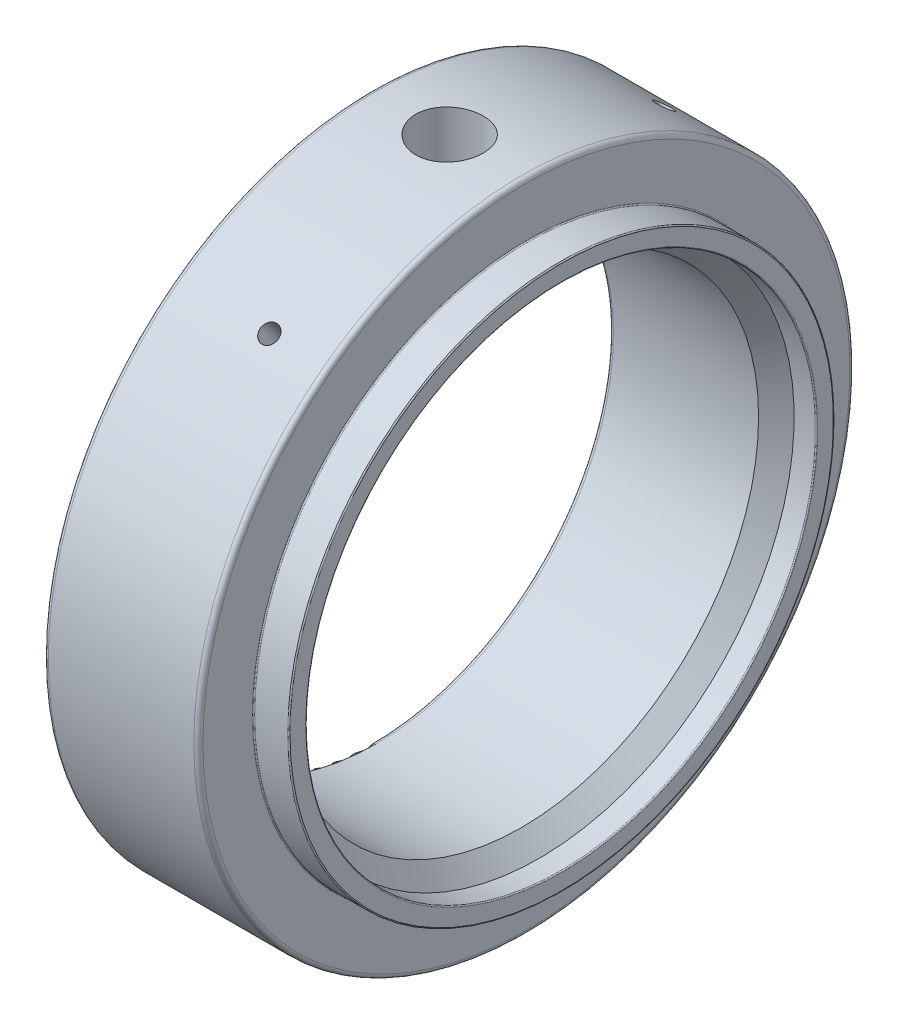
ISO-10303-21;
HEADER;
FILE_DESCRIPTION(('STEP AP214'),'2;1');
FILE_NAME('part.step','',(''),(''),'','','');
FILE_SCHEMA(('AUTOMOTIVE_DESIGN { 1 0 10303 214 1 1 1 1 }'));
ENDSEC;
DATA;
#1=APPLICATION_CONTEXT('core data for automotive mechanical design processes');
#2=APPLICATION_PROTOCOL_DEFINITION('international standard','automotive_design',2000,#1);
#3=PRODUCT_CONTEXT('',#1,'mechanical');
#4=PRODUCT('Part','Part','',(#3));
#5=PRODUCT_RELATED_PRODUCT_CATEGORY('part','',(#4));
#6=PRODUCT_DEFINITION_FORMATION('','',#4);
#7=PRODUCT_DEFINITION_CONTEXT('part definition',#1,'design');
#8=PRODUCT_DEFINITION('design','',#6,#7);
#9=PRODUCT_DEFINITION_SHAPE('','',#8);
#10=(LENGTH_UNIT() NAMED_UNIT(*) SI_UNIT(.MILLI.,.METRE.));
#11=(NAMED_UNIT(*) PLANE_ANGLE_UNIT() SI_UNIT($,.RADIAN.));
#12=(NAMED_UNIT(*) SI_UNIT($,.STERADIAN.) SOLID_ANGLE_UNIT());
#13=UNCERTAINTY_MEASURE_WITH_UNIT(LENGTH_MEASURE(1.E-05),#10,'distance_accuracy_value','');
#14=(GEOMETRIC_REPRESENTATION_CONTEXT(3) GLOBAL_UNCERTAINTY_ASSIGNED_CONTEXT((#13)) GLOBAL_UNIT_ASSIGNED_CONTEXT((#10,
#11,#12)) REPRESENTATION_CONTEXT('',''));
#15=CARTESIAN_POINT('',(0.,0.,0.));
#16=DIRECTION('',(0.,0.,1.));
#17=DIRECTION('',(1.,0.,0.));
#18=AXIS2_PLACEMENT_3D('',#15,#16,#17);
#19=CARTESIAN_POINT('',(0.,0.,0.));
#20=DIRECTION('',(-1.,0.,0.));
#21=DIRECTION('',(0.,0.,1.));
#22=AXIS2_PLACEMENT_3D('',#19,#20,#21);
#23=CYLINDRICAL_SURFACE('',#22,26.02);
#24=CARTESIAN_POINT('',(10.42,21.3669587534692,-14.8490226489001));
#25=CARTESIAN_POINT('',(10.4761481804942,21.3669574659381,-14.8490247878235));
#26=CARTESIAN_POINT('',(10.5323365457762,21.3642500727254,-14.8529226498043));
#27=CARTESIAN_POINT('',(10.6431642924669,21.3534757336192,-14.868408107008));
#28=CARTESIAN_POINT('',(10.69780175209,21.3454024171074,-14.8800048425933));
#29=CARTESIAN_POINT('',(10.803906131119,21.3240911747021,-14.9105291677331));
#30=CARTESIAN_POINT('',(10.8553746104093,21.3108558136662,-14.9294531165917));
#31=CARTESIAN_POINT('',(10.9536926768506,21.2795448816334,-14.9740478258728));
#32=CARTESIAN_POINT('',(11.0005433743418,21.2614704780821,-14.9997169589549));
#33=CARTESIAN_POINT('',(11.0883409735147,21.2209127936836,-15.057041208669));
#34=CARTESIAN_POINT('',(11.1292845179595,21.1984270227013,-15.0886997058241));
#35=CARTESIAN_POINT('',(11.2040771222921,21.1496156141349,-15.1570418924815));
#36=CARTESIAN_POINT('',(11.2379258971259,21.1232898223383,-15.1937257837964));
#37=CARTESIAN_POINT('',(11.2975755742224,21.0674658396433,-15.2710364287853));
#38=CARTESIAN_POINT('',(11.3233741314341,21.0379667277069,-15.3116643268492));
#39=CARTESIAN_POINT('',(11.3661759150158,20.9765793646079,-15.3956559186135));
#40=CARTESIAN_POINT('',(11.3831791879238,20.9446911260877,-15.4390195978369));
#41=CARTESIAN_POINT('',(11.4078996151663,20.8794051617483,-15.5271969890856));
#42=CARTESIAN_POINT('',(11.4156213941221,20.8460081962857,-15.5720099675393));
#43=CARTESIAN_POINT('',(11.4215739008309,20.7786189745776,-15.6618180541209));
#44=CARTESIAN_POINT('',(11.4198046797373,20.7446267215416,-15.7068131612658));
#45=CARTESIAN_POINT('',(11.4068292765525,20.6770354252774,-15.79568681881));
#46=CARTESIAN_POINT('',(11.3956280784618,20.643436183881,-15.8395659462969));
#47=CARTESIAN_POINT('',(11.3641143998613,20.5775944386283,-15.9250092030505));
#48=CARTESIAN_POINT('',(11.3438018927313,20.5453519387362,-15.966573325553));
#49=CARTESIAN_POINT('',(11.2946364869235,20.4831785553302,-16.0462566883532));
#50=CARTESIAN_POINT('',(11.2657813088517,20.4532482914685,-16.0843750056775));
#51=CARTESIAN_POINT('',(11.2003513322428,20.3966211374489,-16.1561238682856));
#52=CARTESIAN_POINT('',(11.1637765027589,20.3699242602538,-16.1897543955777));
#53=CARTESIAN_POINT('',(11.0839172515467,20.3205763701147,-16.2516506056793));
#54=CARTESIAN_POINT('',(11.0406285060772,20.2979279847623,-16.2799128050241));
#55=CARTESIAN_POINT('',(10.9485854578568,20.2574134673838,-16.3302984746201));
#56=CARTESIAN_POINT('',(10.8998311540398,20.2395473362905,-16.3524219436738));
#57=CARTESIAN_POINT('',(10.7982384243771,20.20916909253,-16.3899502865261));
#58=CARTESIAN_POINT('',(10.7453999273776,20.1966570731655,-16.4053550432418));
#59=CARTESIAN_POINT('',(10.6371398423467,20.1773927017637,-16.4290431509705));
#60=CARTESIAN_POINT('',(10.5817182658154,20.1706403240865,-16.4373265336852));
#61=CARTESIAN_POINT('',(10.4699032170995,20.1631178145086,-16.4465533228084));
#62=CARTESIAN_POINT('',(10.413510389379,20.1623438581667,-16.447501421654));
#63=CARTESIAN_POINT('',(10.3013202586606,20.166793391979,-16.4420453776539));
#64=CARTESIAN_POINT('',(10.2455229545122,20.1720168705439,-16.4356412490154));
#65=CARTESIAN_POINT('',(10.1361246716542,20.1882884258402,-16.4156502991676));
#66=CARTESIAN_POINT('',(10.0825230430599,20.1993347654754,-16.4020656200817));
#67=CARTESIAN_POINT('',(9.9790176858823,20.2268931844197,-16.3680685533874));
#68=CARTESIAN_POINT('',(9.92911396979263,20.2434052821941,-16.3476561427125));
#69=CARTESIAN_POINT('',(9.8343931688599,20.2813755204256,-16.3005251373577));
#70=CARTESIAN_POINT('',(9.78957868516602,20.3028361733008,-16.2738033391896));
#71=CARTESIAN_POINT('',(9.70633460920016,20.3500192824529,-16.2147630080062));
#72=CARTESIAN_POINT('',(9.66790504204978,20.3757417554974,-16.1824444529714));
#73=CARTESIAN_POINT('',(9.59850143288535,20.4306608592441,-16.1130522244332));
#74=CARTESIAN_POINT('',(9.56753129370484,20.4598592967135,-16.0759760772002));
#75=CARTESIAN_POINT('',(9.51395234502105,20.5208238569972,-15.9980821047054));
#76=CARTESIAN_POINT('',(9.49134351031719,20.5525899720725,-15.9572642907214));
#77=CARTESIAN_POINT('',(9.45513579531089,20.6177249754962,-15.8730163728156));
#78=CARTESIAN_POINT('',(9.44153439825381,20.651093413345,-15.8295870022876));
#79=CARTESIAN_POINT('',(9.42371940427786,20.7184588464773,-15.7413132988119));
#80=CARTESIAN_POINT('',(9.4195057830107,20.7524558401304,-15.6964689695343));
#81=CARTESIAN_POINT('',(9.4205862324978,20.8200789528759,-15.6066610797986));
#82=CARTESIAN_POINT('',(9.42587416724623,20.8537052972211,-15.5616976149996));
#83=CARTESIAN_POINT('',(9.44579497452529,20.9196686017129,-15.4729094084508));
#84=CARTESIAN_POINT('',(9.46042786528524,20.9520055593441,-15.4290846689225));
#85=CARTESIAN_POINT('',(9.49862213367768,21.0145101339542,-15.343844352609));
#86=CARTESIAN_POINT('',(9.52218363808947,21.0446777201224,-15.3024288100422));
#87=CARTESIAN_POINT('',(9.57756483174632,21.1020434519088,-15.2232242451921));
#88=CARTESIAN_POINT('',(9.60938423867257,21.1292416989968,-15.1854350989912));
#89=CARTESIAN_POINT('',(9.68039846005755,21.1799826588935,-15.1145836178057));
#90=CARTESIAN_POINT('',(9.71959723704951,21.203523395258,-15.0815238392341));
#91=CARTESIAN_POINT('',(9.80426077955695,21.2463439862047,-15.0211398186314));
#92=CARTESIAN_POINT('',(9.84972709060732,21.2656227867574,-14.9938169955038));
#93=CARTESIAN_POINT('',(9.94565930501404,21.2994479696,-14.9457279494552));
#94=CARTESIAN_POINT('',(9.99612898017105,21.313990745689,-14.9249667231532));
#95=CARTESIAN_POINT('',(10.1005700004616,21.3379563914966,-14.8906836206294));
#96=CARTESIAN_POINT('',(10.1545370981946,21.3473853458663,-14.8771531412278));
#97=CARTESIAN_POINT('',(10.2440359209761,21.35840855263,-14.8613201143651));
#98=CARTESIAN_POINT('',(10.2789871501544,21.3616113541656,-14.8567147987609));
#99=CARTESIAN_POINT('',(10.349286939232,21.3658868595319,-14.8505653931893));
#100=CARTESIAN_POINT('',(10.3846354989359,21.3669595644107,-14.8490213017156));
#101=CARTESIAN_POINT('',(10.42,21.3669587534692,-14.8490226489001));
#102=B_SPLINE_CURVE_WITH_KNOTS('',3,(#24,#25,#26,#27,#28,#29,#30,#31,#32,#33,#34,#35,#36,#37,
#38,#39,#40,#41,#42,#43,#44,#45,#46,#47,#48,#49,#50,#51,#52,#53,#54,#55,#56,#57,#58,#59,#60,#61,
#62,#63,#64,#65,#66,#67,#68,#69,#70,#71,#72,#73,#74,#75,#76,#77,#78,#79,#80,#81,#82,#83,#84,#85,
#86,#87,#88,#89,#90,#91,#92,#93,#94,#95,#96,#97,#98,#99,#100,#101),.UNSPECIFIED.,.T.,.F.,(4,2,2,
2,2,2,2,2,2,2,2,2,2,2,2,2,2,2,2,2,2,2,2,2,2,2,2,2,2,2,2,2,2,2,2,2,2,2,4),(0.,0.168315453234023,
0.336831094467285,0.505263112025369,0.673654530995067,0.842141278721586,1.01063479461958,
1.17917734743002,1.34771900843323,1.51617665657379,1.6846333967831,1.85300117769809,
2.02136945052704,2.18978268868687,2.35819660200072,2.52671942718744,2.69524228524765,
2.86376807993082,3.03229312439371,3.20071035317823,3.36912725652036,3.537493945556,
3.70586120340011,3.87431413149449,4.04276772235501,4.21130925897883,4.37985028762215,
4.5483442045789,4.7168376845266,4.88522239224552,5.05360742843555,5.22199485565054,
5.39037652684231,5.5588488739343,5.72736283982408,5.89600482068136,6.06444570117439,
6.17045795128667,6.27647014923521),.UNSPECIFIED.);
#103=CARTESIAN_POINT('',(10.42,21.3669587534692,-14.8490226489001));
#104=VERTEX_POINT('',#103);
#105=EDGE_CURVE('E102',#104,#104,#102,.T.);
#106=ORIENTED_EDGE('',*,*,#105,.T.);
#107=EDGE_LOOP('',(#106));
#108=FACE_BOUND('',#107,.T.);
#109=CARTESIAN_POINT('',(10.42,20.1633287071653,16.4462936689944));
#110=CARTESIAN_POINT('',(10.4761481804942,20.1633304083388,16.4462918417729));
#111=CARTESIAN_POINT('',(10.5323365457762,20.1663310150506,16.4426149320119));
#112=CARTESIAN_POINT('',(10.6431642924669,20.1782467815627,16.4279896020529));
#113=CARTESIAN_POINT('',(10.69780175209,20.1871689716629,16.4170325385981));
#114=CARTESIAN_POINT('',(10.803906131119,20.2106366617083,16.3881332133113));
#115=CARTESIAN_POINT('',(10.8553746104093,20.2251793689628,16.3701944204906));
#116=CARTESIAN_POINT('',(10.9536926768506,20.2594160923225,16.3278044531137));
#117=CARTESIAN_POINT('',(11.0005433743418,20.2791088659194,16.303354849334));
#118=CARTESIAN_POINT('',(11.0883409735147,20.3230332585323,16.2485675962304));
#119=CARTESIAN_POINT('',(11.1292845179595,20.3472674407415,16.2182266214365));
#120=CARTESIAN_POINT('',(11.2040771222921,20.3995079194009,16.1524684244359));
#121=CARTESIAN_POINT('',(11.2379258971259,20.4275143673393,16.1170509983634));
#122=CARTESIAN_POINT('',(11.2975755742224,20.4864429540742,16.0420798403227));
#123=CARTESIAN_POINT('',(11.3233741314341,20.5173659390564,16.0025249075593));
#124=CARTESIAN_POINT('',(11.3661759150158,20.5811831885551,15.9203643665328));
#125=CARTESIAN_POINT('',(11.3831791879238,20.6140774426402,15.8777587744128));
#126=CARTESIAN_POINT('',(11.4078996151663,20.6808437407129,15.7906968946443));
#127=CARTESIAN_POINT('',(11.4156213941221,20.7147152891289,15.7462415400973));
#128=CARTESIAN_POINT('',(11.4215739008309,20.7824693758631,15.6567083990339));
#129=CARTESIAN_POINT('',(11.4198046797373,20.816351914121,15.6116306158735));
#130=CARTESIAN_POINT('',(11.4068292765525,20.8831520707177,15.5221607918287));
#131=CARTESIAN_POINT('',(11.3956280784618,20.9160701891661,15.4777684013857));
#132=CARTESIAN_POINT('',(11.3641143998613,20.9800550744957,15.3909259003166));
#133=CARTESIAN_POINT('',(11.3438018927313,21.0111218359675,15.3484757953656));
#134=CARTESIAN_POINT('',(11.2946364869235,21.0705810934266,15.2667471919657));
#135=CARTESIAN_POINT('',(11.2657813088517,21.0989728729944,15.2274695435706));
#136=CARTESIAN_POINT('',(11.2003513322428,21.1523337473453,15.1532593626894));
#137=CARTESIAN_POINT('',(11.1637765027589,21.1773028284067,15.118326847623));
#138=CARTESIAN_POINT('',(11.0839172515467,21.223199162348,15.0538297033694));
#139=CARTESIAN_POINT('',(11.0406285060772,21.2441237909691,15.0242685601584));
#140=CARTESIAN_POINT('',(10.9485854578568,21.2813902907335,14.9714353337345));
#141=CARTESIAN_POINT('',(10.8998311540398,21.297732160983,14.9481632517485));
#142=CARTESIAN_POINT('',(10.7982384243771,21.3254333406943,14.9086175964396));
#143=CARTESIAN_POINT('',(10.7453999273776,21.3367925633269,14.8923441450775));
#144=CARTESIAN_POINT('',(10.6371398423467,21.354253053541,14.867296715374));
#145=CARTESIAN_POINT('',(10.5817182658154,21.3603543445291,14.8585227036477));
#146=CARTESIAN_POINT('',(10.4699032170995,21.3671502188406,14.8487483555766));
#147=CARTESIAN_POINT('',(10.413510389379,21.3678482586651,14.8477430495319));
#148=CARTESIAN_POINT('',(10.3013202586606,21.3638300302911,14.8535241054918));
#149=CARTESIAN_POINT('',(10.2455229545122,21.3591137725549,14.8603104524401));
#150=CARTESIAN_POINT('',(10.1361246716542,21.3443822866777,14.8814619278361));
#151=CARTESIAN_POINT('',(10.0825230430599,21.3343686388693,14.8958247960306));
#152=CARTESIAN_POINT('',(9.9790176858823,21.3092846906101,14.9316865101315));
#153=CARTESIAN_POINT('',(9.92911396979263,21.2942143730761,14.9531853801459));
#154=CARTESIAN_POINT('',(9.8343931688599,21.2593751590034,15.0026757814365));
#155=CARTESIAN_POINT('',(9.78957868516602,21.2396038755904,15.0306706108049));
#156=CARTESIAN_POINT('',(9.70633460920016,21.1958560941542,15.0922996471022));
#157=CARTESIAN_POINT('',(9.66790504204978,21.1718795795862,15.1259338762182));
#158=CARTESIAN_POINT('',(9.59850143288535,21.1203132448372,15.1978525974137));
#159=CARTESIAN_POINT('',(9.56753129370483,21.0927215447672,15.2361395081214));
#160=CARTESIAN_POINT('',(9.51395234502105,21.0346491628587,15.3162128933445));
#161=CARTESIAN_POINT('',(9.49134351031719,21.0041684897278,15.3579993573119));
#162=CARTESIAN_POINT('',(9.45513579531089,20.9411378333973,15.4438330144925));
#163=CARTESIAN_POINT('',(9.44153439825381,20.9085884310064,15.487879572507));
#164=CARTESIAN_POINT('',(9.42371940427786,20.8423027309586,15.5769669132217));
#165=CARTESIAN_POINT('',(9.4195057830107,20.8085664363803,15.6220076933429));
#166=CARTESIAN_POINT('',(9.4205862324978,20.7408770079735,15.7117656106435));
#167=CARTESIAN_POINT('',(9.42587416724623,20.7069240281867,15.7564829379825));
#168=CARTESIAN_POINT('',(9.44579497452529,20.6397572770114,15.8443642824089));
#169=CARTESIAN_POINT('',(9.46042786528524,20.606543507065,15.8875282964659));
#170=CARTESIAN_POINT('',(9.49862213367768,20.5418338517152,15.9711069652571));
#171=CARTESIAN_POINT('',(9.52218363808947,20.5103379907119,16.0115215809423));
#172=CARTESIAN_POINT('',(9.57756483174633,20.4500138150022,16.088496798392));
#173=CARTESIAN_POINT('',(9.60938423867257,20.4211854091473,16.1250575318518));
#174=CARTESIAN_POINT('',(9.68039846005755,20.3670646982007,16.1933621879453));
#175=CARTESIAN_POINT('',(9.71959723704951,20.3417743057092,16.2251035060561));
#176=CARTESIAN_POINT('',(9.80426077955695,20.29553241412,16.2829093917031));
#177=CARTESIAN_POINT('',(9.84972709060732,20.2745819884302,16.3089725549384));
#178=CARTESIAN_POINT('',(9.94565930501404,20.2376793144283,16.3547425450597));
#179=CARTESIAN_POINT('',(9.99612898017106,20.2217308751708,16.374444528188));
#180=CARTESIAN_POINT('',(10.1005700004616,20.1953816691377,16.4069314892502));
#181=CARTESIAN_POINT('',(10.1545370981946,20.1849743096119,16.4197246874837));
#182=CARTESIAN_POINT('',(10.2440359209761,20.1727930349229,16.4346850475711));
#183=CARTESIAN_POINT('',(10.2789871501544,20.1692489331814,16.4390331750228));
#184=CARTESIAN_POINT('',(10.349286939232,20.1645162341466,16.4448380604538));
#185=CARTESIAN_POINT('',(10.3846354989359,20.1633276356942,16.4462948198558));
#186=CARTESIAN_POINT('',(10.42,20.1633287071653,16.4462936689944));
#187=B_SPLINE_CURVE_WITH_KNOTS('',3,(#109,#110,#111,#112,#113,#114,#115,#116,#117,#118,#119,
#120,#121,#122,#123,#124,#125,#126,#127,#128,#129,#130,#131,#132,#133,#134,#135,#136,#137,#138,
#139,#140,#141,#142,#143,#144,#145,#146,#147,#148,#149,#150,#151,#152,#153,#154,#155,#156,#157,
#158,#159,#160,#161,#162,#163,#164,#165,#166,#167,#168,#169,#170,#171,#172,#173,#174,#175,#176,
#177,#178,#179,#180,#181,#182,#183,#184,#185,#186),.UNSPECIFIED.,.T.,.F.,(4,2,2,2,2,2,2,2,2,2,2,
2,2,2,2,2,2,2,2,2,2,2,2,2,2,2,2,2,2,2,2,2,2,2,2,2,2,2,4),(0.,0.168315453234025,
0.336831094467287,0.505263112025371,0.673654530995072,0.842141278721592,1.01063479461958,
1.17917734743002,1.34771900843323,1.51617665657379,1.68463339678311,1.85300117769809,
2.02136945052705,2.18978268868687,2.35819660200072,2.52671942718744,2.69524228524766,
2.86376807993083,3.03229312439372,3.20071035317823,3.36912725652037,3.537493945556,
3.70586120340011,3.87431413149449,4.04276772235501,4.21130925897884,4.37985028762215,
4.54834420457891,4.71683768452661,4.88522239224552,5.05360742843555,5.22199485565054,
5.39037652684232,5.5588488739343,5.72736283982409,5.89600482068137,6.0644457011744,
6.17045795128667,6.27647014923521),.UNSPECIFIED.);
#188=CARTESIAN_POINT('',(10.42,20.1633287071653,16.4462936689944));
#189=VERTEX_POINT('',#188);
#190=EDGE_CURVE('E92',#189,#189,#187,.T.);
#191=ORIENTED_EDGE('',*,*,#190,.T.);
#192=EDGE_LOOP('',(#191));
#193=FACE_BOUND('',#192,.T.);
#194=CARTESIAN_POINT('',(16.4300000000001,0.,0.));
#195=DIRECTION('',(-1.,0.,0.));
#196=DIRECTION('',(0.,0.,1.));
#197=AXIS2_PLACEMENT_3D('',#194,#195,#196);
#198=CIRCLE('',#197,26.02);
#199=CARTESIAN_POINT('',(16.4300000000001,0.,26.02));
#200=VERTEX_POINT('',#199);
#201=EDGE_CURVE('E66',#200,#200,#198,.T.);
#202=ORIENTED_EDGE('',*,*,#201,.F.);
#203=EDGE_LOOP('',(#202));
#204=FACE_BOUND('',#203,.T.);
#205=CARTESIAN_POINT('',(0.500000000000001,0.,0.));
#206=DIRECTION('',(-1.,0.,0.));
#207=DIRECTION('',(0.,0.,1.));
#208=AXIS2_PLACEMENT_3D('',#205,#206,#207);
#209=CIRCLE('',#208,26.02);
#210=CARTESIAN_POINT('',(0.500000000000001,0.,26.02));
#211=VERTEX_POINT('',#210);
#212=EDGE_CURVE('E112',#211,#211,#209,.T.);
#213=ORIENTED_EDGE('',*,*,#212,.T.);
#214=EDGE_LOOP('',(#213));
#215=FACE_BOUND('',#214,.T.);
#216=ADVANCED_FACE('F50',(#108,#193,#204,#215),#23,.F.);
#217=CARTESIAN_POINT('',(16.4300000000001,0.,0.));
#218=DIRECTION('',(1.,0.,0.));
#219=DIRECTION('',(0.,0.,-1.));
#220=AXIS2_PLACEMENT_3D('',#217,#218,#219);
#221=CONICAL_SURFACE('',#220,26.02,0.785398163397455);
#222=CARTESIAN_POINT('',(18.38,0.,0.));
#223=DIRECTION('',(-1.,0.,0.));
#224=DIRECTION('',(0.,0.,1.));
#225=AXIS2_PLACEMENT_3D('',#222,#223,#224);
#226=CIRCLE('',#225,27.97);
#227=CARTESIAN_POINT('',(18.38,0.,27.97));
#228=VERTEX_POINT('',#227);
#229=EDGE_CURVE('E157',#228,#228,#226,.T.);
#230=ORIENTED_EDGE('',*,*,#229,.F.);
#231=EDGE_LOOP('',(#230));
#232=FACE_BOUND('',#231,.T.);
#233=ORIENTED_EDGE('',*,*,#201,.T.);
#234=EDGE_LOOP('',(#233));
#235=FACE_BOUND('',#234,.T.);
#236=ADVANCED_FACE('F167',(#232,#235),#221,.F.);
#237=CARTESIAN_POINT('',(0.,0.,0.));
#238=DIRECTION('',(-1.,0.,0.));
#239=DIRECTION('',(0.,0.,1.));
#240=AXIS2_PLACEMENT_3D('',#237,#238,#239);
#241=CYLINDRICAL_SURFACE('',#240,27.97);
#242=CARTESIAN_POINT('',(20.715,0.,0.));
#243=DIRECTION('',(-1.,0.,0.));
#244=DIRECTION('',(0.,0.,1.));
#245=AXIS2_PLACEMENT_3D('',#242,#243,#244);
#246=CIRCLE('',#245,27.97);
#247=CARTESIAN_POINT('',(20.715,0.,27.97));
#248=VERTEX_POINT('',#247);
#249=EDGE_CURVE('E154',#248,#248,#246,.T.);
#250=ORIENTED_EDGE('',*,*,#249,.F.);
#251=EDGE_LOOP('',(#250));
#252=FACE_BOUND('',#251,.T.);
#253=ORIENTED_EDGE('',*,*,#229,.T.);
#254=EDGE_LOOP('',(#253));
#255=FACE_BOUND('',#254,.T.);
#256=ADVANCED_FACE('F233',(#252,#255),#241,.F.);
#257=CARTESIAN_POINT('',(20.715,0.,0.));
#258=DIRECTION('',(-1.,0.,0.));
#259=DIRECTION('',(0.,0.,1.));
#260=AXIS2_PLACEMENT_3D('',#257,#258,#259);
#261=TOROIDAL_SURFACE('',#260,28.095,0.125);
#262=CARTESIAN_POINT('',(20.84,0.,0.));
#263=DIRECTION('',(-1.,0.,0.));
#264=DIRECTION('',(0.,0.,1.));
#265=AXIS2_PLACEMENT_3D('',#262,#263,#264);
#266=CIRCLE('',#265,28.095);
#267=CARTESIAN_POINT('',(20.84,0.,28.095));
#268=VERTEX_POINT('',#267);
#269=EDGE_CURVE('E151',#268,#268,#266,.T.);
#270=ORIENTED_EDGE('',*,*,#269,.F.);
#271=EDGE_LOOP('',(#270));
#272=FACE_BOUND('',#271,.T.);
#273=ORIENTED_EDGE('',*,*,#249,.T.);
#274=EDGE_LOOP('',(#273));
#275=FACE_BOUND('',#274,.T.);
#276=ADVANCED_FACE('F230',(#272,#275),#261,.T.);
#277=CARTESIAN_POINT('',(20.84,29.82,0.));
#278=DIRECTION('',(-1.,0.,0.));
#279=DIRECTION('',(0.,0.,1.));
#280=AXIS2_PLACEMENT_3D('',#277,#278,#279);
#281=PLANE('',#280);
#282=CARTESIAN_POINT('',(20.84,0.,0.));
#283=DIRECTION('',(-1.,0.,0.));
#284=DIRECTION('',(0.,0.,1.));
#285=AXIS2_PLACEMENT_3D('',#282,#283,#284);
#286=CIRCLE('',#285,29.82);
#287=CARTESIAN_POINT('',(20.84,0.,29.82));
#288=VERTEX_POINT('',#287);
#289=EDGE_CURVE('E150',#288,#288,#286,.T.);
#290=ORIENTED_EDGE('',*,*,#289,.F.);
#291=EDGE_LOOP('',(#290));
#292=FACE_BOUND('',#291,.T.);
#293=ORIENTED_EDGE('',*,*,#269,.T.);
#294=EDGE_LOOP('',(#293));
#295=FACE_BOUND('',#294,.T.);
#296=ADVANCED_FACE('F222',(#292,#295),#281,.F.);
#297=CARTESIAN_POINT('',(20.715,0.,0.));
#298=DIRECTION('',(-1.,0.,0.));
#299=DIRECTION('',(0.,0.,1.));
#300=AXIS2_PLACEMENT_3D('',#297,#298,#299);
#301=TOROIDAL_SURFACE('',#300,29.82,0.125000000000007);
#302=CARTESIAN_POINT('',(20.715,0.,0.));
#303=DIRECTION('',(-1.,0.,0.));
#304=DIRECTION('',(0.,0.,1.));
#305=AXIS2_PLACEMENT_3D('',#302,#303,#304);
#306=CIRCLE('',#305,29.945);
#307=CARTESIAN_POINT('',(20.715,0.,29.945));
#308=VERTEX_POINT('',#307);
#309=EDGE_CURVE('E141',#308,#308,#306,.T.);
#310=ORIENTED_EDGE('',*,*,#309,.F.);
#311=EDGE_LOOP('',(#310));
#312=FACE_BOUND('',#311,.T.);
#313=ORIENTED_EDGE('',*,*,#289,.T.);
#314=EDGE_LOOP('',(#313));
#315=FACE_BOUND('',#314,.T.);
#316=ADVANCED_FACE('F214',(#312,#315),#301,.T.);
#317=CARTESIAN_POINT('',(0.,0.,0.));
#318=DIRECTION('',(-1.,0.,0.));
#319=DIRECTION('',(0.,0.,1.));
#320=AXIS2_PLACEMENT_3D('',#317,#318,#319);
#321=CYLINDRICAL_SURFACE('',#320,29.945);
#322=CARTESIAN_POINT('',(17.095,0.,0.));
#323=DIRECTION('',(-1.,0.,0.));
#324=DIRECTION('',(0.,0.,1.));
#325=AXIS2_PLACEMENT_3D('',#322,#323,#324);
#326=CIRCLE('',#325,29.945);
#327=CARTESIAN_POINT('',(17.095,0.,29.945));
#328=VERTEX_POINT('',#327);
#329=EDGE_CURVE('E139',#328,#328,#326,.T.);
#330=ORIENTED_EDGE('',*,*,#329,.F.);
#331=EDGE_LOOP('',(#330));
#332=FACE_BOUND('',#331,.T.);
#333=ORIENTED_EDGE('',*,*,#309,.T.);
#334=EDGE_LOOP('',(#333));
#335=FACE_BOUND('',#334,.T.);
#336=ADVANCED_FACE('F207',(#332,#335),#321,.T.);
#337=CARTESIAN_POINT('',(17.095,0.,0.));
#338=DIRECTION('',(-1.,0.,0.));
#339=DIRECTION('',(0.,0.,1.));
#340=AXIS2_PLACEMENT_3D('',#337,#338,#339);
#341=TOROIDAL_SURFACE('',#340,30.07,0.125);
#342=CARTESIAN_POINT('',(16.97,0.,0.));
#343=DIRECTION('',(-1.,0.,0.));
#344=DIRECTION('',(0.,0.,1.));
#345=AXIS2_PLACEMENT_3D('',#342,#343,#344);
#346=CIRCLE('',#345,30.07);
#347=CARTESIAN_POINT('',(16.97,0.,30.07));
#348=VERTEX_POINT('',#347);
#349=EDGE_CURVE('E133',#348,#348,#346,.T.);
#350=ORIENTED_EDGE('',*,*,#349,.F.);
#351=EDGE_LOOP('',(#350));
#352=FACE_BOUND('',#351,.T.);
#353=ORIENTED_EDGE('',*,*,#329,.T.);
#354=EDGE_LOOP('',(#353));
#355=FACE_BOUND('',#354,.T.);
#356=ADVANCED_FACE('F201',(#352,#355),#341,.F.);
#357=CARTESIAN_POINT('',(16.97,35.5,0.));
#358=DIRECTION('',(-1.,0.,0.));
#359=DIRECTION('',(0.,0.,1.));
#360=AXIS2_PLACEMENT_3D('',#357,#358,#359);
#361=PLANE('',#360);
#362=CARTESIAN_POINT('',(16.97,0.,0.));
#363=DIRECTION('',(-1.,0.,0.));
#364=DIRECTION('',(0.,0.,1.));
#365=AXIS2_PLACEMENT_3D('',#362,#363,#364);
#366=CIRCLE('',#365,35.5);
#367=CARTESIAN_POINT('',(16.97,0.,35.5));
#368=VERTEX_POINT('',#367);
#369=EDGE_CURVE('E132',#368,#368,#366,.T.);
#370=ORIENTED_EDGE('',*,*,#369,.F.);
#371=EDGE_LOOP('',(#370));
#372=FACE_BOUND('',#371,.T.);
#373=ORIENTED_EDGE('',*,*,#349,.T.);
#374=EDGE_LOOP('',(#373));
#375=FACE_BOUND('',#374,.T.);
#376=ADVANCED_FACE('F196',(#372,#375),#361,.F.);
#377=CARTESIAN_POINT('',(16.47,0.,0.));
#378=DIRECTION('',(-1.,0.,0.));
#379=DIRECTION('',(0.,0.,1.));
#380=AXIS2_PLACEMENT_3D('',#377,#378,#379);
#381=TOROIDAL_SURFACE('',#380,35.5,0.5);
#382=CARTESIAN_POINT('',(16.47,0.,0.));
#383=DIRECTION('',(-1.,0.,0.));
#384=DIRECTION('',(0.,0.,1.));
#385=AXIS2_PLACEMENT_3D('',#382,#383,#384);
#386=CIRCLE('',#385,36.);
#387=CARTESIAN_POINT('',(16.47,0.,36.));
#388=VERTEX_POINT('',#387);
#389=EDGE_CURVE('E130',#388,#388,#386,.T.);
#390=ORIENTED_EDGE('',*,*,#389,.F.);
#391=EDGE_LOOP('',(#390));
#392=FACE_BOUND('',#391,.T.);
#393=ORIENTED_EDGE('',*,*,#369,.T.);
#394=EDGE_LOOP('',(#393));
#395=FACE_BOUND('',#394,.T.);
#396=ADVANCED_FACE('F193',(#392,#395),#381,.T.);
#397=CARTESIAN_POINT('',(0.,0.,0.));
#398=DIRECTION('',(-1.,0.,0.));
#399=DIRECTION('',(0.,0.,1.));
#400=AXIS2_PLACEMENT_3D('',#397,#398,#399);
#401=CYLINDRICAL_SURFACE('',#400,36.);
#402=CARTESIAN_POINT('',(10.42,29.3415990844754,-20.858345168443));
#403=CARTESIAN_POINT('',(10.3638411879063,29.3415977375915,-20.8583472673777));
#404=CARTESIAN_POINT('',(10.3076419311546,29.3388486272889,-20.8622159332431));
#405=CARTESIAN_POINT('',(10.1967919720463,29.3279115685913,-20.877588188732));
#406=CARTESIAN_POINT('',(10.1421432030553,29.3197171163533,-20.8891009082966));
#407=CARTESIAN_POINT('',(10.0360161473415,29.2980972219112,-20.9194130835519));
#408=CARTESIAN_POINT('',(9.984536328979,29.2846743301104,-20.9382089865236));
#409=CARTESIAN_POINT('',(9.88619783189316,29.2529424002588,-20.9825189118631));
#410=CARTESIAN_POINT('',(9.83933802594934,29.2346345581302,-21.0080312898988));
#411=CARTESIAN_POINT('',(9.75153598875193,29.1935941844351,-21.0650252428046));
#412=CARTESIAN_POINT('',(9.71059580874287,29.1708601254869,-21.096508878116));
#413=CARTESIAN_POINT('',(9.63581237396165,29.1215618428828,-21.1645079230016));
#414=CARTESIAN_POINT('',(9.60196940124822,29.0949974670723,-21.2010235324622));
#415=CARTESIAN_POINT('',(9.54233836594181,29.0387372812901,-21.2780169958512));
#416=CARTESIAN_POINT('',(9.51655145605428,29.0090410240041,-21.318495415713));
#417=CARTESIAN_POINT('',(9.47377207906029,28.9473196481593,-21.4022285673698));
#418=CARTESIAN_POINT('',(9.45677957920736,28.9152945382727,-21.4454832888264));
#419=CARTESIAN_POINT('',(9.43207557356109,28.8498026977308,-21.5335062446201));
#420=CARTESIAN_POINT('',(9.42436165930401,28.8163363435198,-21.5782740830908));
#421=CARTESIAN_POINT('',(9.41842637813699,28.7488903363899,-21.6680515098498));
#422=CARTESIAN_POINT('',(9.42020497632026,28.7149106853589,-21.7130610972486));
#423=CARTESIAN_POINT('',(9.43320218872393,28.6474158701094,-21.8020338945305));
#424=CARTESIAN_POINT('',(9.44441819998671,28.6139005804046,-21.8459973895014));
#425=CARTESIAN_POINT('',(9.47596783220647,28.5482967256605,-21.9316590021199));
#426=CARTESIAN_POINT('',(9.49630147171824,28.5162081635247,-21.9733571151572));
#427=CARTESIAN_POINT('',(9.54551214655929,28.4543993773135,-22.0533379280627));
#428=CARTESIAN_POINT('',(9.57439037504475,28.4246794847325,-22.0916201499675));
#429=CARTESIAN_POINT('',(9.63986958617474,28.3685024247974,-22.1637127331176));
#430=CARTESIAN_POINT('',(9.67647058350585,28.3420452636484,-22.1975230858584));
#431=CARTESIAN_POINT('',(9.75637110013543,28.2931879675779,-22.2597637954547));
#432=CARTESIAN_POINT('',(9.79967287871988,28.2707892065674,-22.2881923305214));
#433=CARTESIAN_POINT('',(9.89173780129957,28.2307478461288,-22.3388881328699));
#434=CARTESIAN_POINT('',(9.94050094616207,28.2131052474561,-22.3611553991732));
#435=CARTESIAN_POINT('',(10.042105657951,28.1831236317462,-22.3989313769344));
#436=CARTESIAN_POINT('',(10.0949472595081,28.1707846597486,-22.4144400309967));
#437=CARTESIAN_POINT('',(10.2032083145037,28.1517965922549,-22.4382838675134));
#438=CARTESIAN_POINT('',(10.258627761901,28.1451474834251,-22.4466190667781));
#439=CARTESIAN_POINT('',(10.3704514930706,28.1377494545443,-22.4558921354853));
#440=CARTESIAN_POINT('',(10.4268554414592,28.1369985630366,-22.4568324766309));
#441=CARTESIAN_POINT('',(10.5390644902428,28.141415422733,-22.4512972912765));
#442=CARTESIAN_POINT('',(10.5948695912288,28.1465831680962,-22.4448217720951));
#443=CARTESIAN_POINT('',(10.7042880157073,28.1626734703961,-22.4246290471534));
#444=CARTESIAN_POINT('',(10.7579016780267,28.1735951340422,-22.4109129654833));
#445=CARTESIAN_POINT('',(10.8614257168641,28.2008508258484,-22.3766058619696));
#446=CARTESIAN_POINT('',(10.9113360870599,28.2171848632481,-22.3560148283897));
#447=CARTESIAN_POINT('',(11.0060513176579,28.2547627252522,-22.3085028065281));
#448=CARTESIAN_POINT('',(11.0508548164682,28.2760078546995,-22.2815801359415));
#449=CARTESIAN_POINT('',(11.1340708173387,28.3227513542107,-22.2221326980951));
#450=CARTESIAN_POINT('',(11.1724833050472,28.3482497338256,-22.1896079182553));
#451=CARTESIAN_POINT('',(11.2418374250192,28.4027310538865,-22.1198287700038));
#452=CARTESIAN_POINT('',(11.2727770190596,28.4317149417792,-22.0825731154694));
#453=CARTESIAN_POINT('',(11.3262931438933,28.4922904757928,-22.0043592706848));
#454=CARTESIAN_POINT('',(11.3488696921026,28.5238821164829,-21.9634010881453));
#455=CARTESIAN_POINT('',(11.3850152887936,28.5887325562577,-21.8789214466361));
#456=CARTESIAN_POINT('',(11.3985856594238,28.6219911098604,-21.8354003649337));
#457=CARTESIAN_POINT('',(11.4163380258155,28.6892103134457,-21.7470065375925));
#458=CARTESIAN_POINT('',(11.4205200262096,28.7231709630818,-21.7021337926207));
#459=CARTESIAN_POINT('',(11.4193767825572,28.7908101641141,-21.6123207797371));
#460=CARTESIAN_POINT('',(11.4140547527564,28.8244888070145,-21.5673805397876));
#461=CARTESIAN_POINT('',(11.3940611258114,28.8906296256823,-21.4787006326016));
#462=CARTESIAN_POINT('',(11.3793895101092,28.923091799035,-21.4349609677484));
#463=CARTESIAN_POINT('',(11.3411135752231,28.985905780406,-21.3499429043462));
#464=CARTESIAN_POINT('',(11.3175091031024,29.0162575522824,-21.3086645479507));
#465=CARTESIAN_POINT('',(11.2620387562501,29.0740289287908,-21.2297723832334));
#466=CARTESIAN_POINT('',(11.2301731839371,29.1014486407066,-21.1921584408358));
#467=CARTESIAN_POINT('',(11.1590762874034,29.1526357404124,-21.1216886180088));
#468=CARTESIAN_POINT('',(11.1198432582393,29.1764022804822,-21.0888338420477));
#469=CARTESIAN_POINT('',(11.0351162840071,29.2196603480737,-21.0288568530051));
#470=CARTESIAN_POINT('',(10.9896207902157,29.2391508150095,-21.0017360621728));
#471=CARTESIAN_POINT('',(10.8936439479609,29.2733571676661,-20.9540312360341));
#472=CARTESIAN_POINT('',(10.8431595065091,29.2880700669167,-20.9334512895966));
#473=CARTESIAN_POINT('',(10.7386984883521,29.3123160167407,-20.8994872978638));
#474=CARTESIAN_POINT('',(10.6847261657713,29.3218552489383,-20.8860946651916));
#475=CARTESIAN_POINT('',(10.595343728085,29.332983596727,-20.8704605588524));
#476=CARTESIAN_POINT('',(10.5605138679449,29.336210723169,-20.865923283103));
#477=CARTESIAN_POINT('',(10.4904613132708,29.3405188893452,-20.859864929757));
#478=CARTESIAN_POINT('',(10.4552386188358,29.3415999296203,-20.8583438514003));
#479=CARTESIAN_POINT('',(10.42,29.3415990844754,-20.858345168443));
#480=B_SPLINE_CURVE_WITH_KNOTS('',3,(#402,#403,#404,#405,#406,#407,#408,#409,#410,#411,#412,
#413,#414,#415,#416,#417,#418,#419,#420,#421,#422,#423,#424,#425,#426,#427,#428,#429,#430,#431,
#432,#433,#434,#435,#436,#437,#438,#439,#440,#441,#442,#443,#444,#445,#446,#447,#448,#449,#450,
#451,#452,#453,#454,#455,#456,#457,#458,#459,#460,#461,#462,#463,#464,#465,#466,#467,#468,#469,
#470,#471,#472,#473,#474,#475,#476,#477,#478,#479),.UNSPECIFIED.,.T.,.F.,(4,2,2,2,2,2,2,2,2,2,2,
2,2,2,2,2,2,2,2,2,2,2,2,2,2,2,2,2,2,2,2,2,2,2,2,2,2,2,4),(0.,0.168347811368222,
0.336897057367516,0.50536418875251,0.673790114188511,0.842274262734764,1.01076510594557,
1.17928004671562,1.34779436000659,1.5162649222049,1.68473486488719,1.85315835665889,
2.02158219118154,2.190029555315,2.35847723979171,2.52698184360877,2.69548647418438,
2.86399253571065,3.03249820236109,3.20094754424068,3.36939671987995,3.53781975163662,
3.70624307091239,3.87471119062398,4.04317968864838,4.21169408450575,4.3802081294344,
4.54869743024603,4.71718664791754,4.88561889363431,5.05405147367266,5.22248693752328,
5.39091623623433,5.55938456022856,5.7278946219614,5.89650981789808,6.06492310192588,
6.17055827529617,6.27619342204291),.UNSPECIFIED.);
#481=CARTESIAN_POINT('',(10.42,29.3415990844754,-20.858345168443));
#482=VERTEX_POINT('',#481);
#483=EDGE_CURVE('E10',#482,#482,#480,.T.);
#484=ORIENTED_EDGE('',*,*,#483,.T.);
#485=EDGE_LOOP('',(#484));
#486=FACE_BOUND('',#485,.T.);
#487=CARTESIAN_POINT('',(10.42,28.1379690381716,22.4556161885372));
#488=CARTESIAN_POINT('',(10.3638411879063,28.1379706845456,22.4556143152845));
#489=CARTESIAN_POINT('',(10.3076419311546,28.1409317273617,22.451905352023));
#490=CARTESIAN_POINT('',(10.1967919720463,28.1526938258035,22.4371548085749));
#491=CARTESIAN_POINT('',(10.1421432030553,28.1615018649899,22.4261044599402));
#492=CARTESIAN_POINT('',(10.0360161473415,28.1846805474463,22.3969669157064));
#493=CARTESIAN_POINT('',(9.984536328979,28.1990484786101,22.3788831509743));
#494=CARTESIAN_POINT('',(9.88619783189316,28.2328954073496,22.3361669916127));
#495=CARTESIAN_POINT('',(9.83933802594933,28.2523731539326,22.3115361998168));
#496=CARTESIAN_POINT('',(9.75153598875193,28.295846997674,22.2563759981203));
#497=CARTESIAN_POINT('',(9.71059580874287,28.3198446544523,22.2258445520714));
#498=CARTESIAN_POINT('',(9.63581237396165,28.3716210833979,22.1597129243981));
#499=CARTESIAN_POINT('',(9.60196940124822,28.3994000057688,22.1241125414173));
#500=CARTESIAN_POINT('',(9.54233836594181,28.4579034641156,22.0488095051547));
#501=CARTESIAN_POINT('',(9.51655145605428,28.4886284208048,22.0091062658946));
#502=CARTESIAN_POINT('',(9.47377207906029,28.5521051753374,21.9266958869575));
#503=CARTESIAN_POINT('',(9.45677957920736,28.5848569656333,21.8839887584664));
#504=CARTESIAN_POINT('',(9.43207557356109,28.6514180636465,21.7967715459708));
#505=CARTESIAN_POINT('',(9.424361659304,28.6852270945948,21.7522619329433));
#506=CARTESIAN_POINT('',(9.41842637813699,28.7529360570324,21.6626826572214));
#507=CARTESIAN_POINT('',(9.42020497632026,28.7868359881871,21.617612996587));
#508=CARTESIAN_POINT('',(9.43320218872393,28.8537580377879,21.5282085894308));
#509=CARTESIAN_POINT('',(9.44441819998671,28.8867803956894,21.4838736437031));
#510=CARTESIAN_POINT('',(9.47596783220647,28.9510407496588,21.3971996306344));
#511=CARTESIAN_POINT('',(9.49630147171824,28.9822787420954,21.3548605673554));
#512=CARTESIAN_POINT('',(9.54551214655929,29.0421244235539,21.2734004489128));
#513=CARTESIAN_POINT('',(9.57439037504475,29.0707317445002,21.2342798441466));
#514=CARTESIAN_POINT('',(9.63986958617474,29.1245470869856,21.1604075792471));
#515=CARTESIAN_POINT('',(9.67647058350585,29.1497551020599,21.1256559274225));
#516=CARTESIAN_POINT('',(9.75637110013543,29.1961178162216,21.0615354155255));
#517=CARTESIAN_POINT('',(9.79967287871988,29.2172711427944,21.0321683782941));
#518=CARTESIAN_POINT('',(9.89173780129957,29.2549661810222,20.9797044953409));
#519=CARTESIAN_POINT('',(9.94050094616207,29.271507891945,20.9566076506149));
#520=CARTESIAN_POINT('',(10.042105657951,29.299556439116,20.9173750012271));
#521=CARTESIAN_POINT('',(10.0949472595081,29.3110632326067,20.9012392556806));
#522=CARTESIAN_POINT('',(10.2032083145037,29.3287495786184,20.876414501669));
#523=CARTESIAN_POINT('',(10.258627761901,29.3349291436232,20.8677254757533));
#524=CARTESIAN_POINT('',(10.3704514930706,29.3418038162562,20.8580580298259));
#525=CARTESIAN_POINT('',(10.4268554414592,29.342500756431,20.8570770334348));
#526=CARTESIAN_POINT('',(10.5390644902428,29.3383974462976,20.8628484953324));
#527=CARTESIAN_POINT('',(10.5948695912288,29.3335972014147,20.869600945989));
#528=CARTESIAN_POINT('',(10.7042880157073,29.3186217967718,20.8906338065757));
#529=CARTESIAN_POINT('',(10.7579016780267,29.3084474713325,20.9049130479783));
#530=CARTESIAN_POINT('',(10.8614257168641,29.2829820536467,20.9405692198062));
#531=CARTESIAN_POINT('',(10.9113360870599,29.2676909526652,20.961946162348));
#532=CARTESIAN_POINT('',(11.0060513176579,29.2323773284731,21.0111644097833));
#533=CARTESIAN_POINT('',(11.0508548164682,29.2123535477907,21.0390074326782));
#534=CARTESIAN_POINT('',(11.1340708173387,29.1680932574742,21.1003261028705));
#535=CARTESIAN_POINT('',(11.1724833050472,29.14385673838,21.1338017628165));
#536=CARTESIAN_POINT('',(11.2418374250192,29.0917978029936,21.2054063088503));
#537=CARTESIAN_POINT('',(11.2727770190596,29.0639744115526,21.2435364601861));
#538=CARTESIAN_POINT('',(11.3262931438934,29.0054873184919,21.323324058109));
#539=CARTESIAN_POINT('',(11.3488696921026,28.9748236227871,21.3649814973506));
#540=CARTESIAN_POINT('',(11.3850152887936,28.9114917830609,21.4506054860767));
#541=CARTESIAN_POINT('',(11.3985856594238,28.8788239340279,21.4945716956001));
#542=CARTESIAN_POINT('',(11.4163380258155,28.8123824571838,21.583551582077));
#543=CARTESIAN_POINT('',(11.4205200262096,28.7786088299183,21.6285652585136));
#544=CARTESIAN_POINT('',(11.4193767825572,28.7109189113586,21.7183400529991));
#545=CARTESIAN_POINT('',(11.4140547527564,28.6770026721654,21.7631012512999));
#546=CARTESIAN_POINT('',(11.3940611258114,28.6099889545573,21.8511233819541));
#547=CARTESIAN_POINT('',(11.3793895101092,28.5768914777677,21.8943843113294));
#548=CARTESIAN_POINT('',(11.3411135752231,28.5124807496899,21.9781991397836));
#549=CARTESIAN_POINT('',(11.3175091031024,28.4811675289599,22.0187529925015));
#550=CARTESIAN_POINT('',(11.2620387562501,28.4212554623702,22.0960320315381));
#551=CARTESIAN_POINT('',(11.2301731839371,28.3926565171999,22.1327573579407));
#552=CARTESIAN_POINT('',(11.1590762874034,28.3390256526116,22.201385671843));
#553=CARTESIAN_POINT('',(11.1198432582393,28.3139945612133,22.233287540029));
#554=CARTESIAN_POINT('',(11.0351162840071,28.2682645183776,22.2914017621145));
#555=CARTESIAN_POINT('',(10.9896207902157,28.2475666417568,22.3176127044886));
#556=CARTESIAN_POINT('',(10.8936439479609,28.2111383682767,22.3636431931916));
#557=CARTESIAN_POINT('',(10.8431595065091,28.1954110787077,22.3834587416964));
#558=CARTESIAN_POINT('',(10.7386984883521,28.1694458839125,22.416127189418));
#559=CARTESIAN_POINT('',(10.6847261657713,28.1592014278564,22.4289883977954));
#560=CARTESIAN_POINT('',(10.595343728085,28.1472403486414,22.4439949959958));
#561=CARTESIAN_POINT('',(10.560513867945,28.143768355859,22.4483477517226));
#562=CARTESIAN_POINT('',(10.4904613132708,28.1391321843803,22.4541589353443));
#563=CARTESIAN_POINT('',(10.4552386188358,28.1379680051023,22.4556173639688));
#564=CARTESIAN_POINT('',(10.42,28.1379690381716,22.4556161885372));
#565=B_SPLINE_CURVE_WITH_KNOTS('',3,(#487,#488,#489,#490,#491,#492,#493,#494,#495,#496,#497,
#498,#499,#500,#501,#502,#503,#504,#505,#506,#507,#508,#509,#510,#511,#512,#513,#514,#515,#516,
#517,#518,#519,#520,#521,#522,#523,#524,#525,#526,#527,#528,#529,#530,#531,#532,#533,#534,#535,
#536,#537,#538,#539,#540,#541,#542,#543,#544,#545,#546,#547,#548,#549,#550,#551,#552,#553,#554,
#555,#556,#557,#558,#559,#560,#561,#562,#563,#564),.UNSPECIFIED.,.T.,.F.,(4,2,2,2,2,2,2,2,2,2,2,
2,2,2,2,2,2,2,2,2,2,2,2,2,2,2,2,2,2,2,2,2,2,2,2,2,2,2,4),(0.,0.168347811368221,
0.336897057367516,0.505364188752512,0.673790114188513,0.842274262734761,1.01076510594557,
1.17928004671562,1.3477943600066,1.5162649222049,1.6847348648872,1.85315835665889,
2.02158219118154,2.190029555315,2.35847723979171,2.52698184360878,2.69548647418438,
2.86399253571065,3.03249820236109,3.20094754424068,3.36939671987995,3.53781975163662,
3.70624307091239,3.87471119062399,4.04317968864838,4.21169408450575,4.3802081294344,
4.54869743024603,4.71718664791754,4.88561889363431,5.05405147367266,5.22248693752329,
5.39091623623434,5.55938456022856,5.72789462196141,5.89650981789809,6.06492310192588,
6.17055827529617,6.27619342204292),.UNSPECIFIED.);
#566=CARTESIAN_POINT('',(10.42,28.1379690381716,22.4556161885372));
#567=VERTEX_POINT('',#566);
#568=EDGE_CURVE('E58',#567,#567,#565,.T.);
#569=ORIENTED_EDGE('',*,*,#568,.T.);
#570=EDGE_LOOP('',(#569));
#571=FACE_BOUND('',#570,.T.);
#572=CARTESIAN_POINT('',(8.54750000000001,35.8093563192638,3.7));
#573=CARTESIAN_POINT('',(8.34025910221796,35.8093588120626,3.69999103801404));
#574=CARTESIAN_POINT('',(8.13288192645397,35.8111747705377,3.68252967622212));
#575=CARTESIAN_POINT('',(7.72387935696177,35.8182412180453,3.61313787582597));
#576=CARTESIAN_POINT('',(7.5222605220798,35.8234954723413,3.5611696479776));
#577=CARTESIAN_POINT('',(7.13075670504795,35.8368372080227,3.42429527379311));
#578=CARTESIAN_POINT('',(6.940864606904,35.8449229509363,3.33940933478151));
#579=CARTESIAN_POINT('',(6.578063617816,35.8630144714174,3.13914842573147));
#580=CARTESIAN_POINT('',(6.40515141021658,35.8730198728888,3.02377942621475));
#581=CARTESIAN_POINT('',(6.0805153565136,35.8938663089264,2.76535242800457));
#582=CARTESIAN_POINT('',(5.92886577485179,35.9047100767087,2.6222013495558));
#583=CARTESIAN_POINT('',(5.6516994516468,35.9259866406582,2.31247281689059));
#584=CARTESIAN_POINT('',(5.52618391595739,35.9364194178439,2.14589428229932));
#585=CARTESIAN_POINT('',(5.30459080520791,35.9557256195855,1.79358307619186));
#586=CARTESIAN_POINT('',(5.20857912645489,35.9645955349526,1.60780874923006));
#587=CARTESIAN_POINT('',(5.0491407690819,35.9797468363388,1.22266837896813));
#588=CARTESIAN_POINT('',(4.98571325478443,35.9860282887426,1.02330268439078));
#589=CARTESIAN_POINT('',(4.89346197686082,35.9952757228498,0.617390297804005));
#590=CARTESIAN_POINT('',(4.86451606496551,35.9982534053008,0.410871637096082));
#591=CARTESIAN_POINT('',(4.84167165046204,36.0005976062067,-0.00411246575611474));
#592=CARTESIAN_POINT('',(4.84777219190775,35.9999642231589,-0.212577854645521));
#593=CARTESIAN_POINT('',(4.8947484827264,35.9951672241696,-0.624708457455241));
#594=CARTESIAN_POINT('',(4.93549288346699,35.9910169423896,-0.828388819910652));
#595=CARTESIAN_POINT('',(5.05039561481053,35.9796678282148,-1.22600492426937));
#596=CARTESIAN_POINT('',(5.12455440032501,35.9724689543159,-1.4199405334653));
#597=CARTESIAN_POINT('',(5.30432438639272,35.955809018582,-1.79297529495923));
#598=CARTESIAN_POINT('',(5.4099935818244,35.9463437919121,-1.97204630527618));
#599=CARTESIAN_POINT('',(5.64974270854965,35.9262129183212,-2.30996162972903));
#600=CARTESIAN_POINT('',(5.78382352033322,35.9155472342022,-2.46880531676589));
#601=CARTESIAN_POINT('',(6.0773282214313,35.8941538347327,-2.76252657018035));
#602=CARTESIAN_POINT('',(6.23686639353279,35.8834260605411,-2.89728995972208));
#603=CARTESIAN_POINT('',(6.57636124827782,35.8631667126812,-3.13814088427297));
#604=CARTESIAN_POINT('',(6.7563179633439,35.8536351409126,-3.24422837374687));
#605=CARTESIAN_POINT('',(7.13163073866875,35.836846640466,-3.42471621842762));
#606=CARTESIAN_POINT('',(7.32699031634998,35.8295902332422,-3.4991093108689));
#607=CARTESIAN_POINT('',(7.72751896893827,35.8181843478741,-3.6140051717879));
#608=CARTESIAN_POINT('',(7.93268772755141,35.8140347696228,-3.65450903223505));
#609=CARTESIAN_POINT('',(8.34600779756911,35.8093297982167,-3.70032936852341));
#610=CARTESIAN_POINT('',(8.55414121222395,35.8087580798052,-3.70580567256704));
#611=CARTESIAN_POINT('',(8.96836271805508,35.8112304687262,-3.6818353846057));
#612=CARTESIAN_POINT('',(9.17445083841158,35.8142745243975,-3.65238929156273));
#613=CARTESIAN_POINT('',(9.57826448435419,35.8236206150641,-3.55954388282429));
#614=CARTESIAN_POINT('',(9.77600761031758,35.829915379891,-3.49622032231868));
#615=CARTESIAN_POINT('',(10.1580655111361,35.845047726077,-3.33749490522538));
#616=CARTESIAN_POINT('',(10.3423799615077,35.8538853688554,-3.24209227380806));
#617=CARTESIAN_POINT('',(10.6930764628806,35.8731471649438,-3.02151720642758));
#618=CARTESIAN_POINT('',(10.8593916570312,35.8835769081574,-2.89623896923764));
#619=CARTESIAN_POINT('',(11.1686901744237,35.9048295122602,-2.6196203150698));
#620=CARTESIAN_POINT('',(11.3116728870507,35.9156523834285,-2.46827921623552));
#621=CARTESIAN_POINT('',(11.5707998856568,35.9365211430658,-2.14313699938374));
#622=CARTESIAN_POINT('',(11.686839830157,35.9465639137701,-1.96925249678546));
#623=CARTESIAN_POINT('',(11.8880689405179,35.9646954111221,-1.60437064000241));
#624=CARTESIAN_POINT('',(11.9732585497168,35.9727841658496,-1.41337353178546));
#625=CARTESIAN_POINT('',(12.1101924220532,35.9860821890773,-1.02005063461176));
#626=CARTESIAN_POINT('',(12.1619994323259,35.9912968571285,-0.817746880822063));
#627=CARTESIAN_POINT('',(12.2309022171992,35.99828133645,-0.407255777963203));
#628=CARTESIAN_POINT('',(12.2479990261932,36.0000512503768,-0.199068604412431));
#629=CARTESIAN_POINT('',(12.2469810762742,35.9999467044254,0.216255408504033));
#630=CARTESIAN_POINT('',(12.2290281858412,35.9980889978183,0.423392667812629));
#631=CARTESIAN_POINT('',(12.1587602226084,35.990971023634,0.831691882959344));
#632=CARTESIAN_POINT('',(12.1064451270926,35.9857107538074,1.03285383484725));
#633=CARTESIAN_POINT('',(11.9689832577146,35.9723769113436,1.42348888655251));
#634=CARTESIAN_POINT('',(11.8838415319979,35.9643037712937,1.61296377843518));
#635=CARTESIAN_POINT('',(11.6831604232927,35.9462435032803,1.97495911520499));
#636=CARTESIAN_POINT('',(11.5676211630928,35.9362563830482,2.14747962857424));
#637=CARTESIAN_POINT('',(11.3088183680349,35.9154314408024,2.4714983752467));
#638=CARTESIAN_POINT('',(11.1654342731359,35.9045900459205,2.62290008659176));
#639=CARTESIAN_POINT('',(10.8552516263351,35.8833085276584,2.89956479961624));
#640=CARTESIAN_POINT('',(10.6884474721856,35.8728685010518,3.02482152934787));
#641=CARTESIAN_POINT('',(10.3356690362485,35.853541951772,3.24590760346983));
#642=CARTESIAN_POINT('',(10.1496447526088,35.8446596519736,3.34165747269923));
#643=CARTESIAN_POINT('',(9.76418451491296,35.8295044389845,3.50043297685606));
#644=CARTESIAN_POINT('',(9.5647639208904,35.823228594648,3.56349539107892));
#645=CARTESIAN_POINT('',(9.22810285719378,35.8155736951895,3.63944247940643));
#646=CARTESIAN_POINT('',(9.09301209304249,35.8132532628453,3.66212035433345));
#647=CARTESIAN_POINT('',(8.82113402133302,35.8101437552975,3.69240203962972));
#648=CARTESIAN_POINT('',(8.68434672141289,35.809354673202,3.70000591783962));
#649=CARTESIAN_POINT('',(8.54750000000001,35.8093563192638,3.7));
#650=B_SPLINE_CURVE_WITH_KNOTS('',3,(#572,#573,#574,#575,#576,#577,#578,#579,#580,#581,#582,
#583,#584,#585,#586,#587,#588,#589,#590,#591,#592,#593,#594,#595,#596,#597,#598,#599,#600,#601,
#602,#603,#604,#605,#606,#607,#608,#609,#610,#611,#612,#613,#614,#615,#616,#617,#618,#619,#620,
#621,#622,#623,#624,#625,#626,#627,#628,#629,#630,#631,#632,#633,#634,#635,#636,#637,#638,#639,
#640,#641,#642,#643,#644,#645,#646,#647,#648,#649),.UNSPECIFIED.,.T.,.F.,(4,2,2,2,2,2,2,2,2,2,2,
2,2,2,2,2,2,2,2,2,2,2,2,2,2,2,2,2,2,2,2,2,2,2,2,2,2,2,4),(0.,0.621222935646923,1.24312731099604,
1.86465051827755,2.4860520819145,3.10957266623897,3.73312201412025,4.35805409164128,
4.98297014089363,5.60566582975809,6.22834453371677,6.84867288868753,7.46900968921393,
8.09049534082685,8.71200025540415,9.33637806055691,9.96075685717059,10.5852786532224,
11.2097803253313,11.8314303964753,12.4530715857539,13.0733284653818,13.693600327611,
14.3161023181066,14.9386205969693,15.5635109272977,16.1883922772132,16.8120956247473,
17.4357803851176,18.056591622394,18.6774032700729,19.2981194861367,19.9188331949012,
20.5422968734752,21.1659099439671,21.7911882913425,22.4157615519061,22.8259735589035,
23.2361837197336),.UNSPECIFIED.);
#651=CARTESIAN_POINT('',(8.54750000000001,35.8093563192638,3.7));
#652=VERTEX_POINT('',#651);
#653=EDGE_CURVE('E63',#652,#652,#650,.T.);
#654=ORIENTED_EDGE('',*,*,#653,.T.);
#655=EDGE_LOOP('',(#654));
#656=FACE_BOUND('',#655,.T.);
#657=CARTESIAN_POINT('',(0.5,0.,0.));
#658=DIRECTION('',(-1.,0.,0.));
#659=DIRECTION('',(0.,0.,1.));
#660=AXIS2_PLACEMENT_3D('',#657,#658,#659);
#661=CIRCLE('',#660,36.);
#662=CARTESIAN_POINT('',(0.5,0.,36.));
#663=VERTEX_POINT('',#662);
#664=EDGE_CURVE('E123',#663,#663,#661,.T.);
#665=ORIENTED_EDGE('',*,*,#664,.F.);
#666=EDGE_LOOP('',(#665));
#667=FACE_BOUND('',#666,.T.);
#668=ORIENTED_EDGE('',*,*,#389,.T.);
#669=EDGE_LOOP('',(#668));
#670=FACE_BOUND('',#669,.T.);
#671=ADVANCED_FACE('F82',(#486,#571,#656,#667,#670),#401,.T.);
#672=CARTESIAN_POINT('',(0.5,0.,0.));
#673=DIRECTION('',(-1.,0.,0.));
#674=DIRECTION('',(0.,0.,1.));
#675=AXIS2_PLACEMENT_3D('',#672,#673,#674);
#676=TOROIDAL_SURFACE('',#675,35.5,0.5);
#677=CARTESIAN_POINT('',(0.,0.,0.));
#678=DIRECTION('',(-1.,0.,0.));
#679=DIRECTION('',(0.,0.,1.));
#680=AXIS2_PLACEMENT_3D('',#677,#678,#679);
#681=CIRCLE('',#680,35.5);
#682=CARTESIAN_POINT('',(0.,0.,35.5));
#683=VERTEX_POINT('',#682);
#684=EDGE_CURVE('E116',#683,#683,#681,.T.);
#685=ORIENTED_EDGE('',*,*,#684,.F.);
#686=EDGE_LOOP('',(#685));
#687=FACE_BOUND('',#686,.T.);
#688=ORIENTED_EDGE('',*,*,#664,.T.);
#689=EDGE_LOOP('',(#688));
#690=FACE_BOUND('',#689,.T.);
#691=ADVANCED_FACE('F181',(#687,#690),#676,.T.);
#692=CARTESIAN_POINT('',(0.,35.5,0.));
#693=DIRECTION('',(1.,0.,0.));
#694=DIRECTION('',(0.,0.,-1.));
#695=AXIS2_PLACEMENT_3D('',#692,#693,#694);
#696=PLANE('',#695);
#697=CARTESIAN_POINT('',(0.,0.,0.));
#698=DIRECTION('',(-1.,0.,0.));
#699=DIRECTION('',(0.,0.,1.));
#700=AXIS2_PLACEMENT_3D('',#697,#698,#699);
#701=CIRCLE('',#700,26.52);
#702=CARTESIAN_POINT('',(0.,0.,26.52));
#703=VERTEX_POINT('',#702);
#704=EDGE_CURVE('E113',#703,#703,#701,.T.);
#705=ORIENTED_EDGE('',*,*,#704,.F.);
#706=EDGE_LOOP('',(#705));
#707=FACE_BOUND('',#706,.T.);
#708=ORIENTED_EDGE('',*,*,#684,.T.);
#709=EDGE_LOOP('',(#708));
#710=FACE_BOUND('',#709,.T.);
#711=ADVANCED_FACE('F180',(#707,#710),#696,.F.);
#712=CARTESIAN_POINT('',(0.5,0.,0.));
#713=DIRECTION('',(-1.,0.,0.));
#714=DIRECTION('',(0.,0.,1.));
#715=AXIS2_PLACEMENT_3D('',#712,#713,#714);
#716=TOROIDAL_SURFACE('',#715,26.52,0.5);
#717=ORIENTED_EDGE('',*,*,#212,.F.);
#718=EDGE_LOOP('',(#717));
#719=FACE_BOUND('',#718,.T.);
#720=ORIENTED_EDGE('',*,*,#704,.T.);
#721=EDGE_LOOP('',(#720));
#722=FACE_BOUND('',#721,.T.);
#723=ADVANCED_FACE('F174',(#719,#722),#716,.T.);
#724=CARTESIAN_POINT('',(8.54750000000001,29.18,0.));
#725=DIRECTION('',(0.,1.,0.));
#726=DIRECTION('',(0.,0.,1.));
#727=AXIS2_PLACEMENT_3D('',#724,#725,#726);
#728=CYLINDRICAL_SURFACE('',#727,3.7);
#729=CARTESIAN_POINT('',(8.54750000000001,29.18,0.));
#730=DIRECTION('',(0.,1.,0.));
#731=DIRECTION('',(0.,0.,1.));
#732=AXIS2_PLACEMENT_3D('',#729,#730,#731);
#733=CIRCLE('',#732,3.7);
#734=CARTESIAN_POINT('',(8.54750000000001,29.18,3.7));
#735=VERTEX_POINT('',#734);
#736=EDGE_CURVE('E103',#735,#735,#733,.T.);
#737=ORIENTED_EDGE('',*,*,#736,.F.);
#738=EDGE_LOOP('',(#737));
#739=FACE_BOUND('',#738,.T.);
#740=ORIENTED_EDGE('',*,*,#653,.F.);
#741=EDGE_LOOP('',(#740));
#742=FACE_BOUND('',#741,.T.);
#743=ADVANCED_FACE('F177',(#739,#742),#728,.F.);
#744=CARTESIAN_POINT('',(8.54750000000001,29.18,0.));
#745=DIRECTION('',(0.,1.,0.));
#746=DIRECTION('',(0.,0.,1.));
#747=AXIS2_PLACEMENT_3D('',#744,#745,#746);
#748=PLANE('',#747);
#749=ORIENTED_EDGE('',*,*,#736,.T.);
#750=EDGE_LOOP('',(#749));
#751=FACE_BOUND('',#750,.T.);
#752=ADVANCED_FACE('F89',(#751),#748,.T.);
#753=CARTESIAN_POINT('',(10.42,15.3178290827071,11.5428121440562));
#754=DIRECTION('',(0.,0.798635510047296,0.601815023152044));
#755=DIRECTION('',(0.,-0.601815023152044,0.798635510047296));
#756=AXIS2_PLACEMENT_3D('',#753,#754,#755);
#757=CYLINDRICAL_SURFACE('',#756,1.);
#758=ORIENTED_EDGE('',*,*,#568,.F.);
#759=EDGE_LOOP('',(#758));
#760=FACE_BOUND('',#759,.T.);
#761=ORIENTED_EDGE('',*,*,#190,.F.);
#762=EDGE_LOOP('',(#761));
#763=FACE_BOUND('',#762,.T.);
#764=ADVANCED_FACE('F81',(#760,#763),#757,.F.);
#765=CARTESIAN_POINT('',(10.42,15.317829082707,-11.5428121440564));
#766=DIRECTION('',(0.,0.798635510047288,-0.601815023152055));
#767=DIRECTION('',(0.,0.601815023152055,0.798635510047288));
#768=AXIS2_PLACEMENT_3D('',#765,#766,#767);
#769=CYLINDRICAL_SURFACE('',#768,1.);
#770=ORIENTED_EDGE('',*,*,#483,.F.);
#771=EDGE_LOOP('',(#770));
#772=FACE_BOUND('',#771,.T.);
#773=ORIENTED_EDGE('',*,*,#105,.F.);
#774=EDGE_LOOP('',(#773));
#775=FACE_BOUND('',#774,.T.);
#776=ADVANCED_FACE('F90',(#772,#775),#769,.F.);
#777=CLOSED_SHELL('',(#216,#236,#256,#276,#296,#316,#336,#356,#376,#396,#671,#691,#711,#723,
#743,#752,#764,#776));
#778=MANIFOLD_SOLID_BREP('B2',#777);
#779=ADVANCED_BREP_SHAPE_REPRESENTATION('',(#18,#778),#14);
#780=SHAPE_DEFINITION_REPRESENTATION(#9,#779);
ENDSEC;
END-ISO-10303-21;
